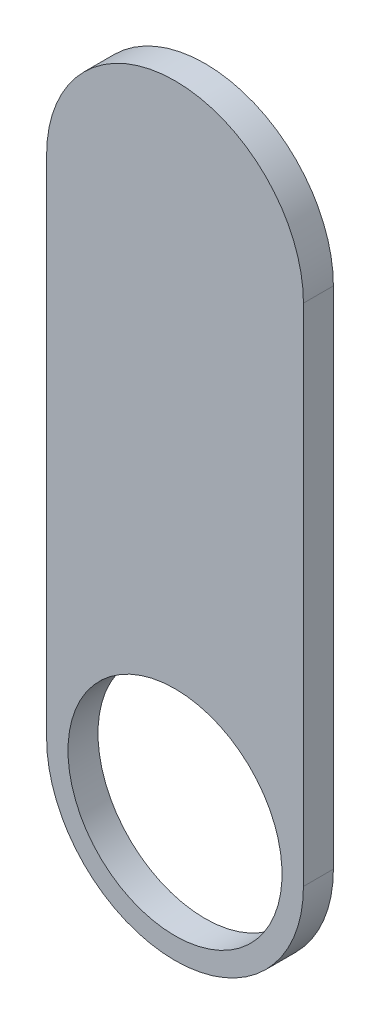
ISO-10303-21;
HEADER;
FILE_DESCRIPTION(('STEP AP214'),'2;1');
FILE_NAME('part.step','',(''),(''),'','','');
FILE_SCHEMA(('AUTOMOTIVE_DESIGN { 1 0 10303 214 1 1 1 1 }'));
ENDSEC;
DATA;
#1=APPLICATION_CONTEXT('core data for automotive mechanical design processes');
#2=APPLICATION_PROTOCOL_DEFINITION('international standard','automotive_design',2000,#1);
#3=PRODUCT_CONTEXT('',#1,'mechanical');
#4=PRODUCT('Part','Part','',(#3));
#5=PRODUCT_RELATED_PRODUCT_CATEGORY('part','',(#4));
#6=PRODUCT_DEFINITION_FORMATION('','',#4);
#7=PRODUCT_DEFINITION_CONTEXT('part definition',#1,'design');
#8=PRODUCT_DEFINITION('design','',#6,#7);
#9=PRODUCT_DEFINITION_SHAPE('','',#8);
#10=(LENGTH_UNIT() NAMED_UNIT(*) SI_UNIT(.MILLI.,.METRE.));
#11=(NAMED_UNIT(*) PLANE_ANGLE_UNIT() SI_UNIT($,.RADIAN.));
#12=(NAMED_UNIT(*) SI_UNIT($,.STERADIAN.) SOLID_ANGLE_UNIT());
#13=UNCERTAINTY_MEASURE_WITH_UNIT(LENGTH_MEASURE(1.E-05),#10,'distance_accuracy_value','');
#14=(GEOMETRIC_REPRESENTATION_CONTEXT(3) GLOBAL_UNCERTAINTY_ASSIGNED_CONTEXT((#13)) GLOBAL_UNIT_ASSIGNED_CONTEXT((#10,
#11,#12)) REPRESENTATION_CONTEXT('',''));
#15=CARTESIAN_POINT('',(0.,0.,0.));
#16=DIRECTION('',(0.,0.,1.));
#17=DIRECTION('',(1.,0.,0.));
#18=AXIS2_PLACEMENT_3D('',#15,#16,#17);
#19=CARTESIAN_POINT('',(127.68,-73.3,-0.045));
#20=DIRECTION('',(0.,0.,-1.));
#21=DIRECTION('',(0.,-1.,0.));
#22=AXIS2_PLACEMENT_3D('',#19,#20,#21);
#23=CYLINDRICAL_SURFACE('',#22,0.125);
#24=CARTESIAN_POINT('',(127.68,-73.3,-0.035));
#25=DIRECTION('',(0.,0.,-1.));
#26=DIRECTION('',(0.,-1.,0.));
#27=AXIS2_PLACEMENT_3D('',#24,#25,#26);
#28=CIRCLE('',#27,0.125);
#29=CARTESIAN_POINT('',(127.68,-73.425,-0.035));
#30=VERTEX_POINT('',#29);
#31=EDGE_CURVE('E132',#30,#30,#28,.T.);
#32=ORIENTED_EDGE('',*,*,#31,.T.);
#33=DIRECTION('',(0.,0.,1.));
#34=VECTOR('',#33,1.);
#35=CARTESIAN_POINT('',(127.68,-73.425,-0.045));
#36=LINE('',#35,#34);
#37=CARTESIAN_POINT('',(127.68,-73.425,0.));
#38=VERTEX_POINT('',#37);
#39=EDGE_CURVE('E11',#30,#38,#36,.T.);
#40=ORIENTED_EDGE('',*,*,#39,.T.);
#41=CARTESIAN_POINT('',(127.68,-73.3,0.));
#42=DIRECTION('',(0.,0.,-1.));
#43=DIRECTION('',(0.,-1.,0.));
#44=AXIS2_PLACEMENT_3D('',#41,#42,#43);
#45=CIRCLE('',#44,0.125);
#46=EDGE_CURVE('E27',#38,#38,#45,.T.);
#47=ORIENTED_EDGE('',*,*,#46,.F.);
#48=ORIENTED_EDGE('',*,*,#39,.F.);
#49=EDGE_LOOP('',(#32,#40,#47,#48));
#50=FACE_BOUND('',#49,.T.);
#51=ADVANCED_FACE('F17',(#50),#23,.F.);
#52=CARTESIAN_POINT('',(127.83,-73.3,-0.035));
#53=DIRECTION('',(-1.,0.,0.));
#54=DIRECTION('',(0.,0.,1.));
#55=AXIS2_PLACEMENT_3D('',#52,#53,#54);
#56=PLANE('',#55);
#57=DIRECTION('',(0.,1.,0.));
#58=VECTOR('',#57,1.);
#59=CARTESIAN_POINT('',(127.83,-73.3,-0.035));
#60=LINE('',#59,#58);
#61=CARTESIAN_POINT('',(127.83,-73.3,-0.035));
#62=VERTEX_POINT('',#61);
#63=CARTESIAN_POINT('',(127.83,-72.71,-0.035));
#64=VERTEX_POINT('',#63);
#65=EDGE_CURVE('E119',#62,#64,#60,.T.);
#66=ORIENTED_EDGE('',*,*,#65,.T.);
#67=DIRECTION('',(0.,0.,1.));
#68=VECTOR('',#67,1.);
#69=CARTESIAN_POINT('',(127.83,-72.71,-0.035));
#70=LINE('',#69,#68);
#71=CARTESIAN_POINT('',(127.83,-72.71,0.));
#72=VERTEX_POINT('',#71);
#73=EDGE_CURVE('E85',#64,#72,#70,.T.);
#74=ORIENTED_EDGE('',*,*,#73,.T.);
#75=DIRECTION('',(0.,1.,0.));
#76=VECTOR('',#75,1.);
#77=CARTESIAN_POINT('',(127.83,-73.3,0.));
#78=LINE('',#77,#76);
#79=CARTESIAN_POINT('',(127.83,-73.3,0.));
#80=VERTEX_POINT('',#79);
#81=EDGE_CURVE('E21',#80,#72,#78,.T.);
#82=ORIENTED_EDGE('',*,*,#81,.F.);
#83=DIRECTION('',(0.,0.,1.));
#84=VECTOR('',#83,1.);
#85=CARTESIAN_POINT('',(127.83,-73.3,-0.035));
#86=LINE('',#85,#84);
#87=EDGE_CURVE('E120',#62,#80,#86,.T.);
#88=ORIENTED_EDGE('',*,*,#87,.F.);
#89=EDGE_LOOP('',(#66,#74,#82,#88));
#90=FACE_BOUND('',#89,.T.);
#91=ADVANCED_FACE('F19',(#90),#56,.F.);
#92=CARTESIAN_POINT('',(127.53,-72.71,0.));
#93=DIRECTION('',(0.,0.,1.));
#94=DIRECTION('',(1.,0.,0.));
#95=AXIS2_PLACEMENT_3D('',#92,#93,#94);
#96=PLANE('',#95);
#97=ORIENTED_EDGE('',*,*,#46,.T.);
#98=EDGE_LOOP('',(#97));
#99=FACE_BOUND('',#98,.T.);
#100=DIRECTION('',(0.,-1.,0.));
#101=VECTOR('',#100,1.);
#102=CARTESIAN_POINT('',(127.53,-72.71,0.));
#103=LINE('',#102,#101);
#104=CARTESIAN_POINT('',(127.53,-72.71,0.));
#105=VERTEX_POINT('',#104);
#106=CARTESIAN_POINT('',(127.53,-73.3,0.));
#107=VERTEX_POINT('',#106);
#108=EDGE_CURVE('E97',#105,#107,#103,.T.);
#109=ORIENTED_EDGE('',*,*,#108,.T.);
#110=CARTESIAN_POINT('',(127.68,-73.3,0.));
#111=DIRECTION('',(0.,0.,1.));
#112=DIRECTION('',(-1.,0.,0.));
#113=AXIS2_PLACEMENT_3D('',#110,#111,#112);
#114=CIRCLE('',#113,0.15);
#115=EDGE_CURVE('E115',#107,#80,#114,.T.);
#116=ORIENTED_EDGE('',*,*,#115,.T.);
#117=ORIENTED_EDGE('',*,*,#81,.T.);
#118=CARTESIAN_POINT('',(127.68,-72.71,0.));
#119=DIRECTION('',(0.,0.,1.));
#120=DIRECTION('',(1.,0.,0.));
#121=AXIS2_PLACEMENT_3D('',#118,#119,#120);
#122=CIRCLE('',#121,0.15);
#123=EDGE_CURVE('E89',#72,#105,#122,.T.);
#124=ORIENTED_EDGE('',*,*,#123,.T.);
#125=EDGE_LOOP('',(#109,#116,#117,#124));
#126=FACE_BOUND('',#125,.T.);
#127=ADVANCED_FACE('F142',(#99,#126),#96,.T.);
#128=CARTESIAN_POINT('',(127.53,-72.71,-0.035));
#129=DIRECTION('',(0.,0.,1.));
#130=DIRECTION('',(1.,0.,0.));
#131=AXIS2_PLACEMENT_3D('',#128,#129,#130);
#132=PLANE('',#131);
#133=ORIENTED_EDGE('',*,*,#31,.F.);
#134=EDGE_LOOP('',(#133));
#135=FACE_BOUND('',#134,.T.);
#136=CARTESIAN_POINT('',(127.68,-72.71,-0.035));
#137=DIRECTION('',(0.,0.,1.));
#138=DIRECTION('',(1.,0.,0.));
#139=AXIS2_PLACEMENT_3D('',#136,#137,#138);
#140=CIRCLE('',#139,0.15);
#141=CARTESIAN_POINT('',(127.53,-72.71,-0.035));
#142=VERTEX_POINT('',#141);
#143=EDGE_CURVE('E78',#64,#142,#140,.T.);
#144=ORIENTED_EDGE('',*,*,#143,.F.);
#145=ORIENTED_EDGE('',*,*,#65,.F.);
#146=CARTESIAN_POINT('',(127.68,-73.3,-0.035));
#147=DIRECTION('',(0.,0.,1.));
#148=DIRECTION('',(-1.,0.,0.));
#149=AXIS2_PLACEMENT_3D('',#146,#147,#148);
#150=CIRCLE('',#149,0.15);
#151=CARTESIAN_POINT('',(127.53,-73.3,-0.035));
#152=VERTEX_POINT('',#151);
#153=EDGE_CURVE('E102',#152,#62,#150,.T.);
#154=ORIENTED_EDGE('',*,*,#153,.F.);
#155=DIRECTION('',(0.,-1.,0.));
#156=VECTOR('',#155,1.);
#157=CARTESIAN_POINT('',(127.53,-72.71,-0.035));
#158=LINE('',#157,#156);
#159=EDGE_CURVE('E95',#142,#152,#158,.T.);
#160=ORIENTED_EDGE('',*,*,#159,.F.);
#161=EDGE_LOOP('',(#144,#145,#154,#160));
#162=FACE_BOUND('',#161,.T.);
#163=ADVANCED_FACE('F100',(#135,#162),#132,.F.);
#164=CARTESIAN_POINT('',(127.68,-73.3,-0.035));
#165=DIRECTION('',(0.,0.,-1.));
#166=DIRECTION('',(-1.,0.,0.));
#167=AXIS2_PLACEMENT_3D('',#164,#165,#166);
#168=CYLINDRICAL_SURFACE('',#167,0.15);
#169=ORIENTED_EDGE('',*,*,#153,.T.);
#170=ORIENTED_EDGE('',*,*,#87,.T.);
#171=ORIENTED_EDGE('',*,*,#115,.F.);
#172=DIRECTION('',(0.,0.,1.));
#173=VECTOR('',#172,1.);
#174=CARTESIAN_POINT('',(127.53,-73.3,-0.035));
#175=LINE('',#174,#173);
#176=EDGE_CURVE('E105',#152,#107,#175,.T.);
#177=ORIENTED_EDGE('',*,*,#176,.F.);
#178=EDGE_LOOP('',(#169,#170,#171,#177));
#179=FACE_BOUND('',#178,.T.);
#180=ADVANCED_FACE('F140',(#179),#168,.T.);
#181=CARTESIAN_POINT('',(127.68,-72.71,-0.035));
#182=DIRECTION('',(0.,0.,-1.));
#183=DIRECTION('',(1.,0.,0.));
#184=AXIS2_PLACEMENT_3D('',#181,#182,#183);
#185=CYLINDRICAL_SURFACE('',#184,0.15);
#186=ORIENTED_EDGE('',*,*,#143,.T.);
#187=DIRECTION('',(0.,0.,1.));
#188=VECTOR('',#187,1.);
#189=CARTESIAN_POINT('',(127.53,-72.71,-0.035));
#190=LINE('',#189,#188);
#191=EDGE_CURVE('E82',#142,#105,#190,.T.);
#192=ORIENTED_EDGE('',*,*,#191,.T.);
#193=ORIENTED_EDGE('',*,*,#123,.F.);
#194=ORIENTED_EDGE('',*,*,#73,.F.);
#195=EDGE_LOOP('',(#186,#192,#193,#194));
#196=FACE_BOUND('',#195,.T.);
#197=ADVANCED_FACE('F80',(#196),#185,.T.);
#198=CARTESIAN_POINT('',(127.53,-72.71,-0.035));
#199=DIRECTION('',(1.,0.,0.));
#200=DIRECTION('',(0.,1.,0.));
#201=AXIS2_PLACEMENT_3D('',#198,#199,#200);
#202=PLANE('',#201);
#203=ORIENTED_EDGE('',*,*,#159,.T.);
#204=ORIENTED_EDGE('',*,*,#176,.T.);
#205=ORIENTED_EDGE('',*,*,#108,.F.);
#206=ORIENTED_EDGE('',*,*,#191,.F.);
#207=EDGE_LOOP('',(#203,#204,#205,#206));
#208=FACE_BOUND('',#207,.T.);
#209=ADVANCED_FACE('F93',(#208),#202,.F.);
#210=CLOSED_SHELL('',(#51,#91,#127,#163,#180,#197,#209));
#211=MANIFOLD_SOLID_BREP('B1',#210);
#212=ADVANCED_BREP_SHAPE_REPRESENTATION('',(#18,#211),#14);
#213=SHAPE_DEFINITION_REPRESENTATION(#9,#212);
ENDSEC;
END-ISO-10303-21;
